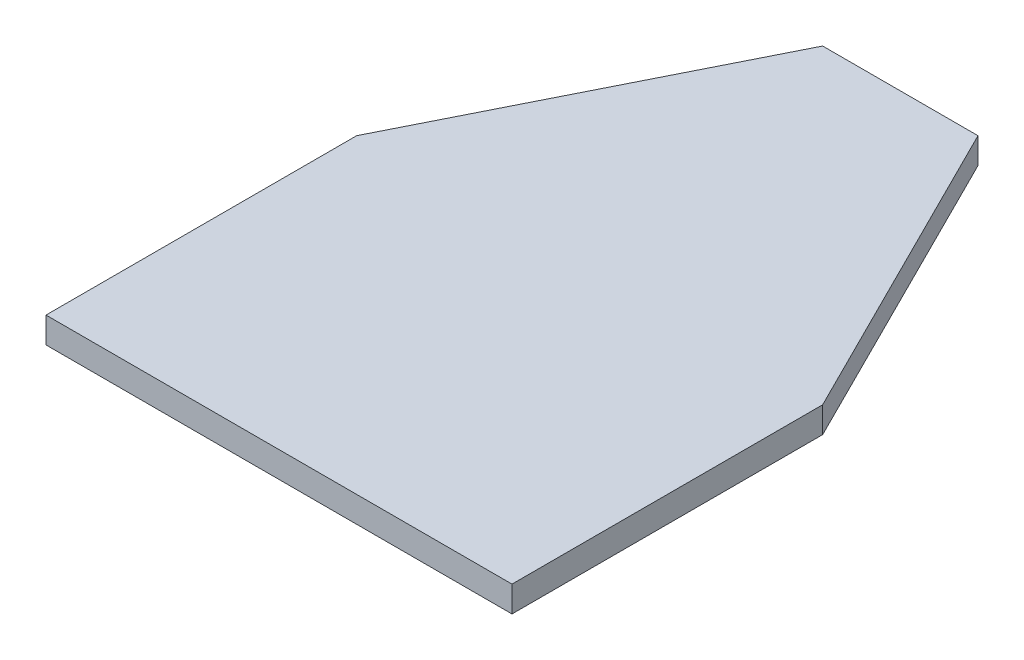
ISO-10303-21;
HEADER;
FILE_DESCRIPTION(('STEP AP214'),'2;1');
FILE_NAME('part.step','',(''),(''),'','','');
FILE_SCHEMA(('AUTOMOTIVE_DESIGN { 1 0 10303 214 1 1 1 1 }'));
ENDSEC;
DATA;
#1=APPLICATION_CONTEXT('core data for automotive mechanical design processes');
#2=APPLICATION_PROTOCOL_DEFINITION('international standard','automotive_design',2000,#1);
#3=PRODUCT_CONTEXT('',#1,'mechanical');
#4=PRODUCT('Part','Part','',(#3));
#5=PRODUCT_RELATED_PRODUCT_CATEGORY('part','',(#4));
#6=PRODUCT_DEFINITION_FORMATION('','',#4);
#7=PRODUCT_DEFINITION_CONTEXT('part definition',#1,'design');
#8=PRODUCT_DEFINITION('design','',#6,#7);
#9=PRODUCT_DEFINITION_SHAPE('','',#8);
#10=(LENGTH_UNIT() NAMED_UNIT(*) SI_UNIT(.MILLI.,.METRE.));
#11=(NAMED_UNIT(*) PLANE_ANGLE_UNIT() SI_UNIT($,.RADIAN.));
#12=(NAMED_UNIT(*) SI_UNIT($,.STERADIAN.) SOLID_ANGLE_UNIT());
#13=UNCERTAINTY_MEASURE_WITH_UNIT(LENGTH_MEASURE(1.E-05),#10,'distance_accuracy_value','');
#14=(GEOMETRIC_REPRESENTATION_CONTEXT(3) GLOBAL_UNCERTAINTY_ASSIGNED_CONTEXT((#13)) GLOBAL_UNIT_ASSIGNED_CONTEXT((#10,
#11,#12)) REPRESENTATION_CONTEXT('',''));
#15=CARTESIAN_POINT('',(0.,0.,0.));
#16=DIRECTION('',(0.,0.,1.));
#17=DIRECTION('',(1.,0.,0.));
#18=AXIS2_PLACEMENT_3D('',#15,#16,#17);
#19=CARTESIAN_POINT('',(0.,6.35,-76.2));
#20=DIRECTION('',(1.,0.,0.));
#21=DIRECTION('',(0.,0.,-1.));
#22=AXIS2_PLACEMENT_3D('',#19,#20,#21);
#23=PLANE('',#22);
#24=DIRECTION('',(0.,0.,1.));
#25=VECTOR('',#24,1.);
#26=CARTESIAN_POINT('',(0.,0.,-76.2));
#27=LINE('',#26,#25);
#28=CARTESIAN_POINT('',(0.,0.,-76.2));
#29=VERTEX_POINT('',#28);
#30=CARTESIAN_POINT('',(0.,0.,0.));
#31=VERTEX_POINT('',#30);
#32=EDGE_CURVE('E117',#29,#31,#27,.T.);
#33=ORIENTED_EDGE('',*,*,#32,.T.);
#34=DIRECTION('',(0.,-1.,0.));
#35=VECTOR('',#34,1.);
#36=CARTESIAN_POINT('',(0.,6.35,0.));
#37=LINE('',#36,#35);
#38=CARTESIAN_POINT('',(0.,6.35,0.));
#39=VERTEX_POINT('',#38);
#40=EDGE_CURVE('E11',#39,#31,#37,.T.);
#41=ORIENTED_EDGE('',*,*,#40,.F.);
#42=DIRECTION('',(0.,0.,1.));
#43=VECTOR('',#42,1.);
#44=CARTESIAN_POINT('',(0.,6.35,-76.2));
#45=LINE('',#44,#43);
#46=CARTESIAN_POINT('',(0.,6.35,-76.2));
#47=VERTEX_POINT('',#46);
#48=EDGE_CURVE('E127',#47,#39,#45,.T.);
#49=ORIENTED_EDGE('',*,*,#48,.F.);
#50=DIRECTION('',(0.,-1.,0.));
#51=VECTOR('',#50,1.);
#52=CARTESIAN_POINT('',(0.,6.35,-76.2));
#53=LINE('',#52,#51);
#54=EDGE_CURVE('E113',#47,#29,#53,.T.);
#55=ORIENTED_EDGE('',*,*,#54,.T.);
#56=EDGE_LOOP('',(#33,#41,#49,#55));
#57=FACE_BOUND('',#56,.T.);
#58=ADVANCED_FACE('F33',(#57),#23,.F.);
#59=CARTESIAN_POINT('',(0.,6.35,0.));
#60=DIRECTION('',(0.,0.,-1.));
#61=DIRECTION('',(-1.,0.,0.));
#62=AXIS2_PLACEMENT_3D('',#59,#60,#61);
#63=PLANE('',#62);
#64=DIRECTION('',(1.,0.,0.));
#65=VECTOR('',#64,1.);
#66=CARTESIAN_POINT('',(0.,0.,0.));
#67=LINE('',#66,#65);
#68=CARTESIAN_POINT('',(114.3,0.,0.));
#69=VERTEX_POINT('',#68);
#70=EDGE_CURVE('E120',#31,#69,#67,.T.);
#71=ORIENTED_EDGE('',*,*,#70,.T.);
#72=DIRECTION('',(0.,-1.,0.));
#73=VECTOR('',#72,1.);
#74=CARTESIAN_POINT('',(114.3,6.35,0.));
#75=LINE('',#74,#73);
#76=CARTESIAN_POINT('',(114.3,6.35,0.));
#77=VERTEX_POINT('',#76);
#78=EDGE_CURVE('E41',#77,#69,#75,.T.);
#79=ORIENTED_EDGE('',*,*,#78,.F.);
#80=DIRECTION('',(1.,0.,0.));
#81=VECTOR('',#80,1.);
#82=CARTESIAN_POINT('',(0.,6.35,0.));
#83=LINE('',#82,#81);
#84=EDGE_CURVE('E86',#39,#77,#83,.T.);
#85=ORIENTED_EDGE('',*,*,#84,.F.);
#86=ORIENTED_EDGE('',*,*,#40,.T.);
#87=EDGE_LOOP('',(#71,#79,#85,#86));
#88=FACE_BOUND('',#87,.T.);
#89=ADVANCED_FACE('F151',(#88),#63,.F.);
#90=CARTESIAN_POINT('',(114.3,6.35,0.));
#91=DIRECTION('',(-1.,0.,0.));
#92=DIRECTION('',(0.,0.,1.));
#93=AXIS2_PLACEMENT_3D('',#90,#91,#92);
#94=PLANE('',#93);
#95=DIRECTION('',(0.,0.,-1.));
#96=VECTOR('',#95,1.);
#97=CARTESIAN_POINT('',(114.3,0.,0.));
#98=LINE('',#97,#96);
#99=CARTESIAN_POINT('',(114.3,0.,-76.2));
#100=VERTEX_POINT('',#99);
#101=EDGE_CURVE('E122',#69,#100,#98,.T.);
#102=ORIENTED_EDGE('',*,*,#101,.T.);
#103=DIRECTION('',(0.,-1.,0.));
#104=VECTOR('',#103,1.);
#105=CARTESIAN_POINT('',(114.3,6.35,-76.2));
#106=LINE('',#105,#104);
#107=CARTESIAN_POINT('',(114.3,6.35,-76.2));
#108=VERTEX_POINT('',#107);
#109=EDGE_CURVE('E108',#108,#100,#106,.T.);
#110=ORIENTED_EDGE('',*,*,#109,.F.);
#111=DIRECTION('',(0.,0.,-1.));
#112=VECTOR('',#111,1.);
#113=CARTESIAN_POINT('',(114.3,6.35,0.));
#114=LINE('',#113,#112);
#115=EDGE_CURVE('E99',#77,#108,#114,.T.);
#116=ORIENTED_EDGE('',*,*,#115,.F.);
#117=ORIENTED_EDGE('',*,*,#78,.T.);
#118=EDGE_LOOP('',(#102,#110,#116,#117));
#119=FACE_BOUND('',#118,.T.);
#120=ADVANCED_FACE('F133',(#119),#94,.F.);
#121=CARTESIAN_POINT('',(114.3,6.35,-76.2));
#122=DIRECTION('',(-0.894427190999916,0.,0.447213595499958));
#123=DIRECTION('',(0.447213595499958,0.,0.894427190999916));
#124=AXIS2_PLACEMENT_3D('',#121,#122,#123);
#125=PLANE('',#124);
#126=DIRECTION('',(-0.447213595499958,0.,-0.894427190999916));
#127=VECTOR('',#126,1.);
#128=CARTESIAN_POINT('',(114.3,0.,-76.2));
#129=LINE('',#128,#127);
#130=CARTESIAN_POINT('',(76.2,0.,-152.4));
#131=VERTEX_POINT('',#130);
#132=EDGE_CURVE('E107',#100,#131,#129,.T.);
#133=ORIENTED_EDGE('',*,*,#132,.T.);
#134=DIRECTION('',(0.,-1.,0.));
#135=VECTOR('',#134,1.);
#136=CARTESIAN_POINT('',(76.2,6.35,-152.4));
#137=LINE('',#136,#135);
#138=CARTESIAN_POINT('',(76.2,6.35,-152.4));
#139=VERTEX_POINT('',#138);
#140=EDGE_CURVE('E104',#139,#131,#137,.T.);
#141=ORIENTED_EDGE('',*,*,#140,.F.);
#142=DIRECTION('',(-0.447213595499958,0.,-0.894427190999916));
#143=VECTOR('',#142,1.);
#144=CARTESIAN_POINT('',(114.3,6.35,-76.2));
#145=LINE('',#144,#143);
#146=EDGE_CURVE('E93',#108,#139,#145,.T.);
#147=ORIENTED_EDGE('',*,*,#146,.F.);
#148=ORIENTED_EDGE('',*,*,#109,.T.);
#149=EDGE_LOOP('',(#133,#141,#147,#148));
#150=FACE_BOUND('',#149,.T.);
#151=ADVANCED_FACE('F105',(#150),#125,.F.);
#152=CARTESIAN_POINT('',(76.2,6.35,-152.4));
#153=DIRECTION('',(0.,0.,1.));
#154=DIRECTION('',(1.,0.,0.));
#155=AXIS2_PLACEMENT_3D('',#152,#153,#154);
#156=PLANE('',#155);
#157=DIRECTION('',(-1.,0.,0.));
#158=VECTOR('',#157,1.);
#159=CARTESIAN_POINT('',(76.2,0.,-152.4));
#160=LINE('',#159,#158);
#161=CARTESIAN_POINT('',(38.1,0.,-152.4));
#162=VERTEX_POINT('',#161);
#163=EDGE_CURVE('E72',#131,#162,#160,.T.);
#164=ORIENTED_EDGE('',*,*,#163,.T.);
#165=DIRECTION('',(0.,-1.,0.));
#166=VECTOR('',#165,1.);
#167=CARTESIAN_POINT('',(38.1,6.35,-152.4));
#168=LINE('',#167,#166);
#169=CARTESIAN_POINT('',(38.1,6.35,-152.4));
#170=VERTEX_POINT('',#169);
#171=EDGE_CURVE('E109',#170,#162,#168,.T.);
#172=ORIENTED_EDGE('',*,*,#171,.F.);
#173=DIRECTION('',(-1.,0.,0.));
#174=VECTOR('',#173,1.);
#175=CARTESIAN_POINT('',(76.2,6.35,-152.4));
#176=LINE('',#175,#174);
#177=EDGE_CURVE('E97',#139,#170,#176,.T.);
#178=ORIENTED_EDGE('',*,*,#177,.F.);
#179=ORIENTED_EDGE('',*,*,#140,.T.);
#180=EDGE_LOOP('',(#164,#172,#178,#179));
#181=FACE_BOUND('',#180,.T.);
#182=ADVANCED_FACE('F111',(#181),#156,.F.);
#183=CARTESIAN_POINT('',(38.1,6.35,-152.4));
#184=DIRECTION('',(0.894427190999916,0.,0.447213595499958));
#185=DIRECTION('',(0.447213595499958,0.,-0.894427190999916));
#186=AXIS2_PLACEMENT_3D('',#183,#184,#185);
#187=PLANE('',#186);
#188=DIRECTION('',(-0.447213595499958,0.,0.894427190999916));
#189=VECTOR('',#188,1.);
#190=CARTESIAN_POINT('',(38.1,0.,-152.4));
#191=LINE('',#190,#189);
#192=EDGE_CURVE('E78',#162,#29,#191,.T.);
#193=ORIENTED_EDGE('',*,*,#192,.T.);
#194=ORIENTED_EDGE('',*,*,#54,.F.);
#195=DIRECTION('',(-0.447213595499958,0.,0.894427190999916));
#196=VECTOR('',#195,1.);
#197=CARTESIAN_POINT('',(38.1,6.35,-152.4));
#198=LINE('',#197,#196);
#199=EDGE_CURVE('E49',#170,#47,#198,.T.);
#200=ORIENTED_EDGE('',*,*,#199,.F.);
#201=ORIENTED_EDGE('',*,*,#171,.T.);
#202=EDGE_LOOP('',(#193,#194,#200,#201));
#203=FACE_BOUND('',#202,.T.);
#204=ADVANCED_FACE('F140',(#203),#187,.F.);
#205=CARTESIAN_POINT('',(0.,6.35,0.));
#206=DIRECTION('',(0.,1.,0.));
#207=DIRECTION('',(0.,0.,1.));
#208=AXIS2_PLACEMENT_3D('',#205,#206,#207);
#209=PLANE('',#208);
#210=ORIENTED_EDGE('',*,*,#48,.T.);
#211=ORIENTED_EDGE('',*,*,#84,.T.);
#212=ORIENTED_EDGE('',*,*,#115,.T.);
#213=ORIENTED_EDGE('',*,*,#146,.T.);
#214=ORIENTED_EDGE('',*,*,#177,.T.);
#215=ORIENTED_EDGE('',*,*,#199,.T.);
#216=EDGE_LOOP('',(#210,#211,#212,#213,#214,#215));
#217=FACE_BOUND('',#216,.T.);
#218=ADVANCED_FACE('F95',(#217),#209,.T.);
#219=CARTESIAN_POINT('',(0.,0.,0.));
#220=DIRECTION('',(0.,1.,0.));
#221=DIRECTION('',(0.,0.,1.));
#222=AXIS2_PLACEMENT_3D('',#219,#220,#221);
#223=PLANE('',#222);
#224=ORIENTED_EDGE('',*,*,#32,.F.);
#225=ORIENTED_EDGE('',*,*,#192,.F.);
#226=ORIENTED_EDGE('',*,*,#163,.F.);
#227=ORIENTED_EDGE('',*,*,#132,.F.);
#228=ORIENTED_EDGE('',*,*,#101,.F.);
#229=ORIENTED_EDGE('',*,*,#70,.F.);
#230=EDGE_LOOP('',(#224,#225,#226,#227,#228,#229));
#231=FACE_BOUND('',#230,.T.);
#232=ADVANCED_FACE('F136',(#231),#223,.F.);
#233=CLOSED_SHELL('',(#58,#89,#120,#151,#182,#204,#218,#232));
#234=MANIFOLD_SOLID_BREP('B2',#233);
#235=ADVANCED_BREP_SHAPE_REPRESENTATION('',(#18,#234),#14);
#236=SHAPE_DEFINITION_REPRESENTATION(#9,#235);
ENDSEC;
END-ISO-10303-21;
